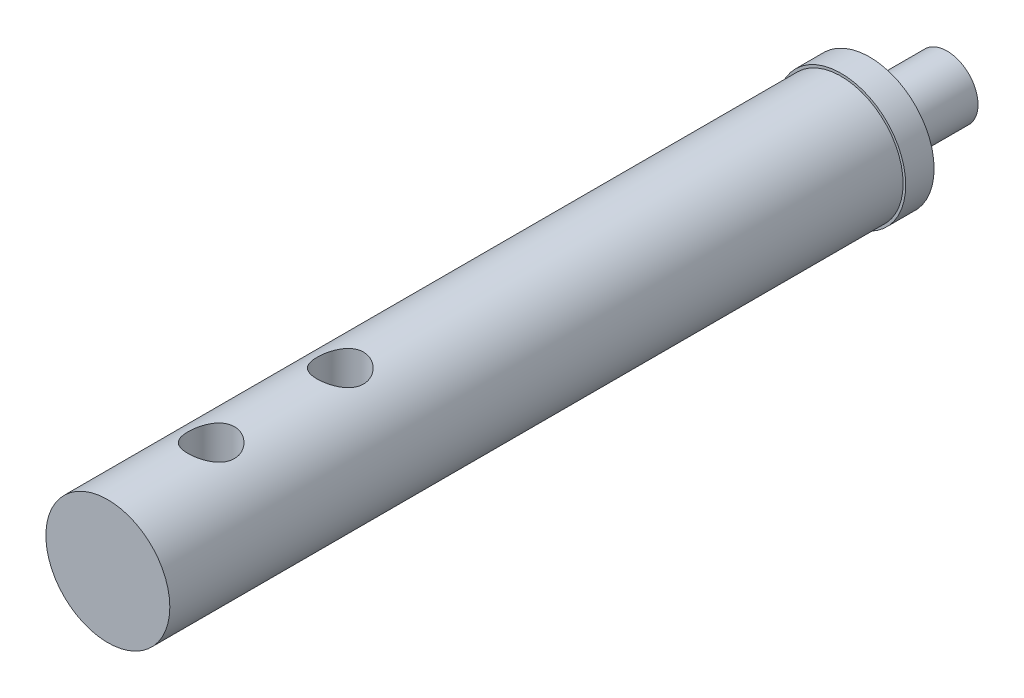
ISO-10303-21;
HEADER;
FILE_DESCRIPTION(('STEP AP214'),'2;1');
FILE_NAME('part.step','',(''),(''),'','','');
FILE_SCHEMA(('AUTOMOTIVE_DESIGN { 1 0 10303 214 1 1 1 1 }'));
ENDSEC;
DATA;
#1=APPLICATION_CONTEXT('core data for automotive mechanical design processes');
#2=APPLICATION_PROTOCOL_DEFINITION('international standard','automotive_design',2000,#1);
#3=PRODUCT_CONTEXT('',#1,'mechanical');
#4=PRODUCT('Part','Part','',(#3));
#5=PRODUCT_RELATED_PRODUCT_CATEGORY('part','',(#4));
#6=PRODUCT_DEFINITION_FORMATION('','',#4);
#7=PRODUCT_DEFINITION_CONTEXT('part definition',#1,'design');
#8=PRODUCT_DEFINITION('design','',#6,#7);
#9=PRODUCT_DEFINITION_SHAPE('','',#8);
#10=(LENGTH_UNIT() NAMED_UNIT(*) SI_UNIT(.MILLI.,.METRE.));
#11=(NAMED_UNIT(*) PLANE_ANGLE_UNIT() SI_UNIT($,.RADIAN.));
#12=(NAMED_UNIT(*) SI_UNIT($,.STERADIAN.) SOLID_ANGLE_UNIT());
#13=UNCERTAINTY_MEASURE_WITH_UNIT(LENGTH_MEASURE(1.E-05),#10,'distance_accuracy_value','');
#14=(GEOMETRIC_REPRESENTATION_CONTEXT(3) GLOBAL_UNCERTAINTY_ASSIGNED_CONTEXT((#13)) GLOBAL_UNIT_ASSIGNED_CONTEXT((#10,
#11,#12)) REPRESENTATION_CONTEXT('',''));
#15=CARTESIAN_POINT('',(0.,0.,0.));
#16=DIRECTION('',(0.,0.,1.));
#17=DIRECTION('',(1.,0.,0.));
#18=AXIS2_PLACEMENT_3D('',#15,#16,#17);
#19=CARTESIAN_POINT('',(0.,0.,15.));
#20=DIRECTION('',(0.,0.,-1.));
#21=DIRECTION('',(-1.,0.,0.));
#22=AXIS2_PLACEMENT_3D('',#19,#20,#21);
#23=CYLINDRICAL_SURFACE('',#22,6.);
#24=CARTESIAN_POINT('',(0.,0.,15.));
#25=DIRECTION('',(0.,0.,1.));
#26=DIRECTION('',(1.,0.,0.));
#27=AXIS2_PLACEMENT_3D('',#24,#25,#26);
#28=CIRCLE('',#27,6.);
#29=CARTESIAN_POINT('',(6.,0.,15.));
#30=VERTEX_POINT('',#29);
#31=EDGE_CURVE('E45',#30,#30,#28,.T.);
#32=ORIENTED_EDGE('',*,*,#31,.F.);
#33=EDGE_LOOP('',(#32));
#34=FACE_BOUND('',#33,.T.);
#35=CARTESIAN_POINT('',(0.,0.,0.));
#36=DIRECTION('',(0.,0.,1.));
#37=DIRECTION('',(1.,0.,0.));
#38=AXIS2_PLACEMENT_3D('',#35,#36,#37);
#39=CIRCLE('',#38,6.);
#40=CARTESIAN_POINT('',(6.,0.,0.));
#41=VERTEX_POINT('',#40);
#42=EDGE_CURVE('E50',#41,#41,#39,.T.);
#43=ORIENTED_EDGE('',*,*,#42,.T.);
#44=EDGE_LOOP('',(#43));
#45=FACE_BOUND('',#44,.T.);
#46=ADVANCED_FACE('F33',(#34,#45),#23,.T.);
#47=CARTESIAN_POINT('',(0.,0.,0.));
#48=DIRECTION('',(0.,0.,1.));
#49=DIRECTION('',(1.,0.,0.));
#50=AXIS2_PLACEMENT_3D('',#47,#48,#49);
#51=PLANE('',#50);
#52=ORIENTED_EDGE('',*,*,#42,.F.);
#53=EDGE_LOOP('',(#52));
#54=FACE_BOUND('',#53,.T.);
#55=ADVANCED_FACE('F95',(#54),#51,.F.);
#56=CARTESIAN_POINT('',(0.,0.,20.5));
#57=DIRECTION('',(0.,0.,-1.));
#58=DIRECTION('',(-1.,0.,0.));
#59=AXIS2_PLACEMENT_3D('',#56,#57,#58);
#60=CYLINDRICAL_SURFACE('',#59,12.5);
#61=CARTESIAN_POINT('',(0.,0.,20.5));
#62=DIRECTION('',(0.,0.,1.));
#63=DIRECTION('',(1.,0.,0.));
#64=AXIS2_PLACEMENT_3D('',#61,#62,#63);
#65=CIRCLE('',#64,12.5);
#66=CARTESIAN_POINT('',(12.5,0.,20.5));
#67=VERTEX_POINT('',#66);
#68=EDGE_CURVE('E55',#67,#67,#65,.T.);
#69=ORIENTED_EDGE('',*,*,#68,.F.);
#70=EDGE_LOOP('',(#69));
#71=FACE_BOUND('',#70,.T.);
#72=CARTESIAN_POINT('',(0.,0.,15.));
#73=DIRECTION('',(0.,0.,1.));
#74=DIRECTION('',(1.,0.,0.));
#75=AXIS2_PLACEMENT_3D('',#72,#73,#74);
#76=CIRCLE('',#75,12.5);
#77=CARTESIAN_POINT('',(12.5,0.,15.));
#78=VERTEX_POINT('',#77);
#79=EDGE_CURVE('E58',#78,#78,#76,.T.);
#80=ORIENTED_EDGE('',*,*,#79,.T.);
#81=EDGE_LOOP('',(#80));
#82=FACE_BOUND('',#81,.T.);
#83=ADVANCED_FACE('F100',(#71,#82),#60,.T.);
#84=CARTESIAN_POINT('',(0.,0.,20.5));
#85=DIRECTION('',(0.,0.,1.));
#86=DIRECTION('',(1.,0.,0.));
#87=AXIS2_PLACEMENT_3D('',#84,#85,#86);
#88=PLANE('',#87);
#89=CARTESIAN_POINT('',(0.,0.,20.5));
#90=DIRECTION('',(0.,0.,1.));
#91=DIRECTION('',(1.,0.,0.));
#92=AXIS2_PLACEMENT_3D('',#89,#90,#91);
#93=CIRCLE('',#92,12.);
#94=CARTESIAN_POINT('',(12.,0.,20.5));
#95=VERTEX_POINT('',#94);
#96=EDGE_CURVE('E10',#95,#95,#93,.T.);
#97=ORIENTED_EDGE('',*,*,#96,.F.);
#98=EDGE_LOOP('',(#97));
#99=FACE_BOUND('',#98,.T.);
#100=ORIENTED_EDGE('',*,*,#68,.T.);
#101=EDGE_LOOP('',(#100));
#102=FACE_BOUND('',#101,.T.);
#103=ADVANCED_FACE('F108',(#99,#102),#88,.T.);
#104=CARTESIAN_POINT('',(0.,0.,15.));
#105=DIRECTION('',(0.,0.,1.));
#106=DIRECTION('',(1.,0.,0.));
#107=AXIS2_PLACEMENT_3D('',#104,#105,#106);
#108=PLANE('',#107);
#109=ORIENTED_EDGE('',*,*,#31,.T.);
#110=EDGE_LOOP('',(#109));
#111=FACE_BOUND('',#110,.T.);
#112=ORIENTED_EDGE('',*,*,#79,.F.);
#113=EDGE_LOOP('',(#112));
#114=FACE_BOUND('',#113,.T.);
#115=ADVANCED_FACE('F91',(#111,#114),#108,.F.);
#116=CARTESIAN_POINT('',(0.,0.,162.5));
#117=DIRECTION('',(0.,0.,-1.));
#118=DIRECTION('',(-1.,0.,0.));
#119=AXIS2_PLACEMENT_3D('',#116,#117,#118);
#120=CYLINDRICAL_SURFACE('',#119,12.);
#121=CARTESIAN_POINT('',(0.,-12.,122.));
#122=CARTESIAN_POINT('',(0.12182192021614,-12.0000004149463,122.000000562589));
#123=CARTESIAN_POINT('',(0.243636002691334,-11.9981409348073,121.995049364538));
#124=CARTESIAN_POINT('',(0.486392423781213,-11.9907535477711,121.975293911887));
#125=CARTESIAN_POINT('',(0.607334471202249,-11.9852244680872,121.960486507286));
#126=CARTESIAN_POINT('',(0.847347381687182,-11.970649565472,121.921174413436));
#127=CARTESIAN_POINT('',(0.966419205128129,-11.9616056132673,121.896674882519));
#128=CARTESIAN_POINT('',(1.2019581040135,-11.9402382455256,121.83820576059));
#129=CARTESIAN_POINT('',(1.31842414848255,-11.9279135559973,121.804232490447));
#130=CARTESIAN_POINT('',(1.54765442429003,-11.9003384511568,121.727214849951));
#131=CARTESIAN_POINT('',(1.660426734491,-11.8850950009216,121.684192050998));
#132=CARTESIAN_POINT('',(1.88185705605878,-11.8520536393113,121.589393964957));
#133=CARTESIAN_POINT('',(1.99051352350808,-11.8342547811235,121.537615432482));
#134=CARTESIAN_POINT('',(2.30927279411985,-11.7776768093622,121.369731594457));
#135=CARTESIAN_POINT('',(2.51234231941558,-11.7356939966761,121.241018203868));
#136=CARTESIAN_POINT('',(2.90206977477989,-11.6455850212357,120.948156633399));
#137=CARTESIAN_POINT('',(3.08780172063125,-11.5972851945296,120.782840477992));
#138=CARTESIAN_POINT('',(3.42974311725175,-11.500801507554,120.423737421702));
#139=CARTESIAN_POINT('',(3.58594353155376,-11.4526176872201,120.229941838426));
#140=CARTESIAN_POINT('',(3.79764477617944,-11.3834841407686,119.917559070828));
#141=CARTESIAN_POINT('',(3.86547493196535,-11.3605705131175,119.807562616254));
#142=CARTESIAN_POINT('',(3.99157408188854,-11.3168804194774,119.581831512047));
#143=CARTESIAN_POINT('',(4.04984690983614,-11.2961030977882,119.466099187672));
#144=CARTESIAN_POINT('',(4.15634309619243,-11.2573544123991,119.229634242611));
#145=CARTESIAN_POINT('',(4.20456527896396,-11.2393833770156,119.108901038945));
#146=CARTESIAN_POINT('',(4.29047551547084,-11.2068698048304,118.863350953977));
#147=CARTESIAN_POINT('',(4.32816865016454,-11.1923256148824,118.738536074949));
#148=CARTESIAN_POINT('',(4.39133833063889,-11.167687799886,118.490864282486));
#149=CARTESIAN_POINT('',(4.41724869222401,-11.1574374723367,118.368133574559));
#150=CARTESIAN_POINT('',(4.45874705417236,-11.1409189584307,118.120724885637));
#151=CARTESIAN_POINT('',(4.47433956871922,-11.1346490306496,117.996047780687));
#152=CARTESIAN_POINT('',(4.49504192825721,-11.1263077224061,117.745703904304));
#153=CARTESIAN_POINT('',(4.50015334189904,-11.124235713664,117.620037283793));
#154=CARTESIAN_POINT('',(4.4998396408155,-11.124362586323,117.368723898627));
#155=CARTESIAN_POINT('',(4.49441493477359,-11.1265613020677,117.24307713339));
#156=CARTESIAN_POINT('',(4.47373138181252,-11.1348931002806,117.000345583509));
#157=CARTESIAN_POINT('',(4.45908334347361,-11.1407817124043,116.883200175152));
#158=CARTESIAN_POINT('',(4.42068867776497,-11.1560711786316,116.650631735769));
#159=CARTESIAN_POINT('',(4.39693902815624,-11.1654731993557,116.535209290103));
#160=CARTESIAN_POINT('',(4.31234407385655,-11.1985472030748,116.192770983112));
#161=CARTESIAN_POINT('',(4.23813423625877,-11.2270952052095,115.969371280221));
#162=CARTESIAN_POINT('',(4.05490721343479,-11.294571324263,115.534132319446));
#163=CARTESIAN_POINT('',(3.94525805379048,-11.3336856090865,115.322591744781));
#164=CARTESIAN_POINT('',(3.69468362169032,-11.417826234714,114.920172587469));
#165=CARTESIAN_POINT('',(3.55374755073014,-11.4628546145386,114.729301172593));
#166=CARTESIAN_POINT('',(3.23345300799873,-11.5574411862383,114.360186122089));
#167=CARTESIAN_POINT('',(3.05214885027356,-11.607100429164,114.18365330368));
#168=CARTESIAN_POINT('',(2.66193788370926,-11.7027518394278,113.862986875577));
#169=CARTESIAN_POINT('',(2.45302684040983,-11.748743442469,113.718858245353));
#170=CARTESIAN_POINT('',(2.00917028059689,-11.8327918458053,113.465208596408));
#171=CARTESIAN_POINT('',(1.77387213379262,-11.8707149483013,113.356257198474));
#172=CARTESIAN_POINT('',(1.28651055931184,-11.9333615492963,113.180052245027));
#173=CARTESIAN_POINT('',(1.03445463312944,-11.9580909097264,113.1127801694));
#174=CARTESIAN_POINT('',(0.535125728885336,-11.9905332973328,113.025131619306));
#175=CARTESIAN_POINT('',(0.288310863440806,-11.9990810722223,113.002452162351));
#176=CARTESIAN_POINT('',(-0.205717430518199,-12.0007768095524,112.997926826798));
#177=CARTESIAN_POINT('',(-0.452930758520922,-11.9939281862917,113.016071894972));
#178=CARTESIAN_POINT('',(-0.930786126866777,-11.9661512982893,113.090930073153));
#179=CARTESIAN_POINT('',(-1.16169991458787,-11.9457741475744,113.146134437354));
#180=CARTESIAN_POINT('',(-1.61082533431484,-11.8935442940439,113.291558411525));
#181=CARTESIAN_POINT('',(-1.82903531000967,-11.8616900987367,113.381782575637));
#182=CARTESIAN_POINT('',(-2.25374302875423,-11.7884888040033,113.597558494317));
#183=CARTESIAN_POINT('',(-2.45970824228691,-11.7468902777666,113.724070377444));
#184=CARTESIAN_POINT('',(-2.84817914393921,-11.6587998753534,114.00775712078));
#185=CARTESIAN_POINT('',(-3.03067612982123,-11.6123061955645,114.164943301224));
#186=CARTESIAN_POINT('',(-3.37808840855273,-11.516200958323,114.516201253386));
#187=CARTESIAN_POINT('',(-3.54136933947527,-11.4665650100462,114.711883953797));
#188=CARTESIAN_POINT('',(-3.83314678656079,-11.372360357102,115.128996752467));
#189=CARTESIAN_POINT('',(-3.96164017919755,-11.3277921076647,115.350429160208));
#190=CARTESIAN_POINT('',(-4.12541953452075,-11.2687303690453,115.697922796397));
#191=CARTESIAN_POINT('',(-4.17527938653557,-11.2503030894951,115.816647329586));
#192=CARTESIAN_POINT('',(-4.26475585416721,-11.2166905930926,116.058323845116));
#193=CARTESIAN_POINT('',(-4.30437682733461,-11.2015039975232,116.181274003754));
#194=CARTESIAN_POINT('',(-4.37296242168505,-11.1749073223601,116.430466472104));
#195=CARTESIAN_POINT('',(-4.40193024471253,-11.163496108165,116.556707780413));
#196=CARTESIAN_POINT('',(-4.44890662829911,-11.1448585297206,116.81151813959));
#197=CARTESIAN_POINT('',(-4.46691595320738,-11.1376318736025,116.940087027466));
#198=CARTESIAN_POINT('',(-4.4909611175474,-11.1279568107625,117.190138338187));
#199=CARTESIAN_POINT('',(-4.4976937576826,-11.1252304971503,117.311543515748));
#200=CARTESIAN_POINT('',(-4.50131029580419,-11.1237678185175,117.554568299403));
#201=CARTESIAN_POINT('',(-4.49819087218451,-11.1250327991546,117.676187963996));
#202=CARTESIAN_POINT('',(-4.48213280066959,-11.131512007523,117.918611778483));
#203=CARTESIAN_POINT('',(-4.46919877710471,-11.1367243753675,118.039416285416));
#204=CARTESIAN_POINT('',(-4.4336489114592,-11.150924738849,118.279410101132));
#205=CARTESIAN_POINT('',(-4.41102942370239,-11.1599141561698,118.398598784262));
#206=CARTESIAN_POINT('',(-4.35718066722756,-11.1810458214159,118.630811506595));
#207=CARTESIAN_POINT('',(-4.3262397945842,-11.1930817833517,118.743912139277));
#208=CARTESIAN_POINT('',(-4.25575591081443,-11.220069483486,118.967056271898));
#209=CARTESIAN_POINT('',(-4.21620988547499,-11.23502224319,119.077098685333));
#210=CARTESIAN_POINT('',(-4.08512625929658,-11.2836374066331,119.401595505612));
#211=CARTESIAN_POINT('',(-3.98110253179988,-11.3210734609741,119.610592817196));
#212=CARTESIAN_POINT('',(-3.73655960136619,-11.4041928736043,120.019509886323));
#213=CARTESIAN_POINT('',(-3.59441315608532,-11.4502056852775,120.218379513829));
#214=CARTESIAN_POINT('',(-3.28000639093495,-11.5441926723435,120.590437563583));
#215=CARTESIAN_POINT('',(-3.10773650011231,-11.5921674673836,120.763617791262));
#216=CARTESIAN_POINT('',(-2.82485495768739,-11.6632064644304,121.005245875948));
#217=CARTESIAN_POINT('',(-2.72355677041141,-11.6873329442322,121.084523984934));
#218=CARTESIAN_POINT('',(-2.51433251035991,-11.7341212355869,121.234254321495));
#219=CARTESIAN_POINT('',(-2.40640888366378,-11.7567835814237,121.304709777492));
#220=CARTESIAN_POINT('',(-2.18454509687348,-11.8000231112314,121.436294134108));
#221=CARTESIAN_POINT('',(-2.0706017726869,-11.8205991816831,121.497418062869));
#222=CARTESIAN_POINT('',(-1.83755175113717,-11.8590616275344,121.609759993606));
#223=CARTESIAN_POINT('',(-1.71844727331546,-11.8769491446375,121.66098220304));
#224=CARTESIAN_POINT('',(-1.47053797162901,-11.9102407175975,121.755097964792));
#225=CARTESIAN_POINT('',(-1.3415368617529,-11.9255011706843,121.797526838323));
#226=CARTESIAN_POINT('',(-1.07989915577463,-11.9520331999052,121.870612963128));
#227=CARTESIAN_POINT('',(-0.94726417967495,-11.9633065233273,121.901275371348));
#228=CARTESIAN_POINT('',(-0.679492491904579,-11.9814979813589,121.950485060083));
#229=CARTESIAN_POINT('',(-0.54435622620707,-11.9884168847946,121.969034479318));
#230=CARTESIAN_POINT('',(-0.27280993479055,-11.9976674031164,121.993790938277));
#231=CARTESIAN_POINT('',(-0.136400054481801,-11.9999995353981,121.999999370088));
#232=CARTESIAN_POINT('',(0.,-12.,122.));
#233=B_SPLINE_CURVE_WITH_KNOTS('',3,(#121,#122,#123,#124,#125,#126,#127,#128,#129,#130,#131,
#132,#133,#134,#135,#136,#137,#138,#139,#140,#141,#142,#143,#144,#145,#146,#147,#148,#149,#150,
#151,#152,#153,#154,#155,#156,#157,#158,#159,#160,#161,#162,#163,#164,#165,#166,#167,#168,#169,
#170,#171,#172,#173,#174,#175,#176,#177,#178,#179,#180,#181,#182,#183,#184,#185,#186,#187,#188,
#189,#190,#191,#192,#193,#194,#195,#196,#197,#198,#199,#200,#201,#202,#203,#204,#205,#206,#207,
#208,#209,#210,#211,#212,#213,#214,#215,#216,#217,#218,#219,#220,#221,#222,#223,#224,#225,#226,
#227,#228,#229,#230,#231,#232),.UNSPECIFIED.,.T.,.F.,(4,2,2,2,2,2,2,2,2,2,2,2,2,2,2,2,2,2,2,2,2,
2,2,2,2,2,2,2,2,2,2,2,2,2,2,2,2,2,2,2,2,2,2,2,2,2,2,2,2,2,2,2,2,2,2,4),(0.,0.365338024506952,
0.730792865566524,1.09605346575198,1.46145611308565,1.82599742407274,2.19067415273862,
2.91947018392638,3.67616860257936,4.43309819286655,4.82642681378562,5.21959726757258,
5.61281368524465,6.00584002102327,6.38291145568139,6.75981780772977,7.13666774608809,
7.51350306718049,7.86768402280123,8.22198268815954,8.92994647641831,9.65130458621119,
10.3729120569284,11.143016934675,11.9132400717526,12.6953735931829,13.477159325566,
14.2173829236784,14.9574423863163,15.6690654723159,16.3807811322343,17.1134089903886,
17.8463077351967,18.6217279182704,19.3972177022049,19.7870381951625,20.1766925107004,
20.5662296182681,20.9557395527225,21.3201489316714,21.6846811837186,22.0490417862154,
22.4135396573091,22.7667469946614,23.1200782532196,23.8262105801188,24.5693581369517,
25.3127422403354,25.7049754844993,26.0970647789657,26.4893622558027,26.8814926686162,
27.2908478409866,27.7000233978563,28.1091266894863,28.5181838309154),.UNSPECIFIED.);
#234=CARTESIAN_POINT('',(0.,-12.,122.));
#235=VERTEX_POINT('',#234);
#236=EDGE_CURVE('E36',#235,#235,#233,.T.);
#237=ORIENTED_EDGE('',*,*,#236,.T.);
#238=EDGE_LOOP('',(#237));
#239=FACE_BOUND('',#238,.T.);
#240=CARTESIAN_POINT('',(0.,12.,122.));
#241=CARTESIAN_POINT('',(-0.121821920216147,12.0000004149463,122.000000562589));
#242=CARTESIAN_POINT('',(-0.243636002691342,11.9981409348073,121.995049364538));
#243=CARTESIAN_POINT('',(-0.486392423781221,11.9907535477711,121.975293911887));
#244=CARTESIAN_POINT('',(-0.607334471202256,11.9852244680872,121.960486507286));
#245=CARTESIAN_POINT('',(-0.847347381687191,11.970649565472,121.921174413436));
#246=CARTESIAN_POINT('',(-0.966419205128139,11.9616056132673,121.896674882519));
#247=CARTESIAN_POINT('',(-1.20195810401351,11.9402382455256,121.83820576059));
#248=CARTESIAN_POINT('',(-1.31842414848256,11.9279135559973,121.804232490447));
#249=CARTESIAN_POINT('',(-1.54765442429004,11.9003384511568,121.727214849951));
#250=CARTESIAN_POINT('',(-1.66042673449101,11.8850950009216,121.684192050998));
#251=CARTESIAN_POINT('',(-1.88185705605879,11.8520536393113,121.589393964957));
#252=CARTESIAN_POINT('',(-1.99051352350809,11.8342547811235,121.537615432482));
#253=CARTESIAN_POINT('',(-2.30927279411986,11.7776768093622,121.369731594457));
#254=CARTESIAN_POINT('',(-2.51234231941558,11.7356939966761,121.241018203868));
#255=CARTESIAN_POINT('',(-2.90206977477989,11.6455850212357,120.948156633399));
#256=CARTESIAN_POINT('',(-3.08780172063126,11.5972851945296,120.782840477992));
#257=CARTESIAN_POINT('',(-3.42974311725176,11.500801507554,120.423737421702));
#258=CARTESIAN_POINT('',(-3.58594353155377,11.4526176872201,120.229941838426));
#259=CARTESIAN_POINT('',(-3.79764477617945,11.3834841407686,119.917559070828));
#260=CARTESIAN_POINT('',(-3.86547493196535,11.3605705131175,119.807562616254));
#261=CARTESIAN_POINT('',(-3.99157408188855,11.3168804194774,119.581831512047));
#262=CARTESIAN_POINT('',(-4.04984690983615,11.2961030977882,119.466099187672));
#263=CARTESIAN_POINT('',(-4.15634309619243,11.2573544123991,119.229634242611));
#264=CARTESIAN_POINT('',(-4.20456527896397,11.2393833770156,119.108901038945));
#265=CARTESIAN_POINT('',(-4.29047551547084,11.2068698048304,118.863350953977));
#266=CARTESIAN_POINT('',(-4.32816865016454,11.1923256148824,118.738536074949));
#267=CARTESIAN_POINT('',(-4.3913383306389,11.167687799886,118.490864282486));
#268=CARTESIAN_POINT('',(-4.41724869222401,11.1574374723367,118.368133574559));
#269=CARTESIAN_POINT('',(-4.45874705417236,11.1409189584307,118.120724885637));
#270=CARTESIAN_POINT('',(-4.47433956871923,11.1346490306496,117.996047780687));
#271=CARTESIAN_POINT('',(-4.49504192825722,11.1263077224061,117.745703904304));
#272=CARTESIAN_POINT('',(-4.50015334189905,11.124235713664,117.620037283793));
#273=CARTESIAN_POINT('',(-4.49983964081551,11.124362586323,117.368723898627));
#274=CARTESIAN_POINT('',(-4.4944149347736,11.1265613020677,117.24307713339));
#275=CARTESIAN_POINT('',(-4.47373138181252,11.1348931002806,117.000345583509));
#276=CARTESIAN_POINT('',(-4.45908334347362,11.1407817124043,116.883200175152));
#277=CARTESIAN_POINT('',(-4.42068867776498,11.1560711786316,116.650631735769));
#278=CARTESIAN_POINT('',(-4.39693902815625,11.1654731993557,116.535209290103));
#279=CARTESIAN_POINT('',(-4.31234407385656,11.1985472030748,116.192770983112));
#280=CARTESIAN_POINT('',(-4.23813423625878,11.2270952052095,115.969371280221));
#281=CARTESIAN_POINT('',(-4.05490721343479,11.294571324263,115.534132319446));
#282=CARTESIAN_POINT('',(-3.94525805379049,11.3336856090865,115.322591744781));
#283=CARTESIAN_POINT('',(-3.69468362169033,11.417826234714,114.920172587469));
#284=CARTESIAN_POINT('',(-3.55374755073015,11.4628546145386,114.729301172593));
#285=CARTESIAN_POINT('',(-3.23345300799873,11.5574411862383,114.360186122089));
#286=CARTESIAN_POINT('',(-3.05214885027357,11.607100429164,114.18365330368));
#287=CARTESIAN_POINT('',(-2.66193788370927,11.7027518394278,113.862986875577));
#288=CARTESIAN_POINT('',(-2.45302684040983,11.748743442469,113.718858245353));
#289=CARTESIAN_POINT('',(-2.0091702805969,11.8327918458053,113.465208596408));
#290=CARTESIAN_POINT('',(-1.77387213379263,11.8707149483013,113.356257198474));
#291=CARTESIAN_POINT('',(-1.28651055931185,11.9333615492963,113.180052245027));
#292=CARTESIAN_POINT('',(-1.03445463312945,11.9580909097264,113.1127801694));
#293=CARTESIAN_POINT('',(-0.535125728885344,11.9905332973328,113.025131619306));
#294=CARTESIAN_POINT('',(-0.288310863440814,11.9990810722223,113.002452162351));
#295=CARTESIAN_POINT('',(0.205717430518191,12.0007768095524,112.997926826798));
#296=CARTESIAN_POINT('',(0.452930758520915,11.9939281862917,113.016071894972));
#297=CARTESIAN_POINT('',(0.93078612686677,11.9661512982893,113.090930073153));
#298=CARTESIAN_POINT('',(1.16169991458786,11.9457741475744,113.146134437354));
#299=CARTESIAN_POINT('',(1.61082533431483,11.8935442940439,113.291558411525));
#300=CARTESIAN_POINT('',(1.82903531000967,11.8616900987367,113.381782575637));
#301=CARTESIAN_POINT('',(2.25374302875422,11.7884888040033,113.597558494317));
#302=CARTESIAN_POINT('',(2.4597082422869,11.7468902777666,113.724070377444));
#303=CARTESIAN_POINT('',(2.8481791439392,11.6587998753534,114.00775712078));
#304=CARTESIAN_POINT('',(3.03067612982123,11.6123061955645,114.164943301224));
#305=CARTESIAN_POINT('',(3.37808840855273,11.516200958323,114.516201253386));
#306=CARTESIAN_POINT('',(3.54136933947527,11.4665650100462,114.711883953797));
#307=CARTESIAN_POINT('',(3.83314678656078,11.372360357102,115.128996752467));
#308=CARTESIAN_POINT('',(3.96164017919754,11.3277921076647,115.350429160208));
#309=CARTESIAN_POINT('',(4.12541953452074,11.2687303690453,115.697922796397));
#310=CARTESIAN_POINT('',(4.17527938653557,11.2503030894951,115.816647329586));
#311=CARTESIAN_POINT('',(4.26475585416721,11.2166905930926,116.058323845116));
#312=CARTESIAN_POINT('',(4.3043768273346,11.2015039975232,116.181274003754));
#313=CARTESIAN_POINT('',(4.37296242168504,11.1749073223601,116.430466472104));
#314=CARTESIAN_POINT('',(4.40193024471253,11.163496108165,116.556707780413));
#315=CARTESIAN_POINT('',(4.4489066282991,11.1448585297206,116.81151813959));
#316=CARTESIAN_POINT('',(4.46691595320738,11.1376318736025,116.940087027466));
#317=CARTESIAN_POINT('',(4.49096111754739,11.1279568107625,117.190138338187));
#318=CARTESIAN_POINT('',(4.49769375768259,11.1252304971503,117.311543515748));
#319=CARTESIAN_POINT('',(4.50131029580418,11.1237678185175,117.554568299403));
#320=CARTESIAN_POINT('',(4.4981908721845,11.1250327991546,117.676187963996));
#321=CARTESIAN_POINT('',(4.48213280066958,11.131512007523,117.918611778483));
#322=CARTESIAN_POINT('',(4.46919877710471,11.1367243753675,118.039416285416));
#323=CARTESIAN_POINT('',(4.4336489114592,11.150924738849,118.279410101132));
#324=CARTESIAN_POINT('',(4.41102942370238,11.1599141561698,118.398598784262));
#325=CARTESIAN_POINT('',(4.35718066722755,11.1810458214159,118.630811506595));
#326=CARTESIAN_POINT('',(4.3262397945842,11.1930817833517,118.743912139277));
#327=CARTESIAN_POINT('',(4.25575591081442,11.220069483486,118.967056271898));
#328=CARTESIAN_POINT('',(4.21620988547499,11.23502224319,119.077098685333));
#329=CARTESIAN_POINT('',(4.08512625929658,11.2836374066331,119.401595505612));
#330=CARTESIAN_POINT('',(3.98110253179987,11.3210734609741,119.610592817196));
#331=CARTESIAN_POINT('',(3.73655960136618,11.4041928736043,120.019509886323));
#332=CARTESIAN_POINT('',(3.59441315608531,11.4502056852775,120.218379513829));
#333=CARTESIAN_POINT('',(3.28000639093494,11.5441926723435,120.590437563583));
#334=CARTESIAN_POINT('',(3.1077365001123,11.5921674673836,120.763617791262));
#335=CARTESIAN_POINT('',(2.82485495768738,11.6632064644304,121.005245875948));
#336=CARTESIAN_POINT('',(2.7235567704114,11.6873329442322,121.084523984934));
#337=CARTESIAN_POINT('',(2.51433251035991,11.7341212355869,121.234254321495));
#338=CARTESIAN_POINT('',(2.40640888366377,11.7567835814237,121.304709777492));
#339=CARTESIAN_POINT('',(2.18454509687348,11.8000231112314,121.436294134108));
#340=CARTESIAN_POINT('',(2.07060177268689,11.8205991816831,121.497418062869));
#341=CARTESIAN_POINT('',(1.83755175113716,11.8590616275344,121.609759993606));
#342=CARTESIAN_POINT('',(1.71844727331545,11.8769491446375,121.66098220304));
#343=CARTESIAN_POINT('',(1.470537971629,11.9102407175975,121.755097964792));
#344=CARTESIAN_POINT('',(1.34153686175289,11.9255011706843,121.797526838323));
#345=CARTESIAN_POINT('',(1.07989915577462,11.9520331999052,121.870612963128));
#346=CARTESIAN_POINT('',(0.94726417967494,11.9633065233273,121.901275371348));
#347=CARTESIAN_POINT('',(0.67949249190457,11.9814979813589,121.950485060083));
#348=CARTESIAN_POINT('',(0.544356226207062,11.9884168847946,121.969034479318));
#349=CARTESIAN_POINT('',(0.272809934790544,11.9976674031164,121.993790938277));
#350=CARTESIAN_POINT('',(0.136400054481794,11.9999995353981,121.999999370088));
#351=CARTESIAN_POINT('',(0.,12.,122.));
#352=B_SPLINE_CURVE_WITH_KNOTS('',3,(#240,#241,#242,#243,#244,#245,#246,#247,#248,#249,#250,
#251,#252,#253,#254,#255,#256,#257,#258,#259,#260,#261,#262,#263,#264,#265,#266,#267,#268,#269,
#270,#271,#272,#273,#274,#275,#276,#277,#278,#279,#280,#281,#282,#283,#284,#285,#286,#287,#288,
#289,#290,#291,#292,#293,#294,#295,#296,#297,#298,#299,#300,#301,#302,#303,#304,#305,#306,#307,
#308,#309,#310,#311,#312,#313,#314,#315,#316,#317,#318,#319,#320,#321,#322,#323,#324,#325,#326,
#327,#328,#329,#330,#331,#332,#333,#334,#335,#336,#337,#338,#339,#340,#341,#342,#343,#344,#345,
#346,#347,#348,#349,#350,#351),.UNSPECIFIED.,.T.,.F.,(4,2,2,2,2,2,2,2,2,2,2,2,2,2,2,2,2,2,2,2,2,
2,2,2,2,2,2,2,2,2,2,2,2,2,2,2,2,2,2,2,2,2,2,2,2,2,2,2,2,2,2,2,2,2,2,4),(0.,0.365338024506952,
0.730792865566525,1.09605346575198,1.46145611308565,1.82599742407274,2.19067415273862,
2.91947018392638,3.67616860257936,4.43309819286655,4.82642681378562,5.21959726757258,
5.61281368524465,6.00584002102327,6.38291145568136,6.75981780772974,7.13666774608808,
7.51350306718049,7.86768402280121,8.22198268815954,8.92994647641831,9.65130458621118,
10.3729120569284,11.143016934675,11.9132400717526,12.6953735931829,13.477159325566,
14.2173829236784,14.9574423863163,15.6690654723159,16.3807811322343,17.1134089903886,
17.8463077351967,18.6217279182704,19.3972177022049,19.7870381951625,20.1766925107004,
20.566229618268,20.9557395527224,21.3201489316713,21.6846811837186,22.0490417862153,
22.4135396573091,22.7667469946614,23.1200782532196,23.8262105801188,24.5693581369517,
25.3127422403354,25.7049754844993,26.0970647789657,26.4893622558027,26.8814926686161,
27.2908478409866,27.7000233978563,28.1091266894863,28.5181838309154),.UNSPECIFIED.);
#353=CARTESIAN_POINT('',(0.,12.,122.));
#354=VERTEX_POINT('',#353);
#355=EDGE_CURVE('E156',#354,#354,#352,.T.);
#356=ORIENTED_EDGE('',*,*,#355,.T.);
#357=EDGE_LOOP('',(#356));
#358=FACE_BOUND('',#357,.T.);
#359=CARTESIAN_POINT('',(0.,-12.,147.));
#360=CARTESIAN_POINT('',(0.121821920216141,-12.0000004149463,147.000000562589));
#361=CARTESIAN_POINT('',(0.243636002691335,-11.9981409348073,146.995049364538));
#362=CARTESIAN_POINT('',(0.486392423781216,-11.9907535477711,146.975293911887));
#363=CARTESIAN_POINT('',(0.607334471202253,-11.9852244680872,146.960486507286));
#364=CARTESIAN_POINT('',(0.84734738168719,-11.970649565472,146.921174413436));
#365=CARTESIAN_POINT('',(0.966419205128139,-11.9616056132673,146.896674882519));
#366=CARTESIAN_POINT('',(1.20195810401351,-11.9402382455256,146.83820576059));
#367=CARTESIAN_POINT('',(1.31842414848256,-11.9279135559973,146.804232490447));
#368=CARTESIAN_POINT('',(1.54765442429004,-11.9003384511568,146.727214849951));
#369=CARTESIAN_POINT('',(1.660426734491,-11.8850950009216,146.684192050998));
#370=CARTESIAN_POINT('',(1.88185705605878,-11.8520536393113,146.589393964957));
#371=CARTESIAN_POINT('',(1.99051352350808,-11.8342547811235,146.537615432482));
#372=CARTESIAN_POINT('',(2.30927279411985,-11.7776768093622,146.369731594457));
#373=CARTESIAN_POINT('',(2.51234231941558,-11.7356939966761,146.241018203868));
#374=CARTESIAN_POINT('',(2.90206977477989,-11.6455850212357,145.948156633399));
#375=CARTESIAN_POINT('',(3.08780172063126,-11.5972851945296,145.782840477992));
#376=CARTESIAN_POINT('',(3.42974311725176,-11.500801507554,145.423737421702));
#377=CARTESIAN_POINT('',(3.58594353155377,-11.4526176872201,145.229941838426));
#378=CARTESIAN_POINT('',(3.79764477617944,-11.3834841407686,144.917559070828));
#379=CARTESIAN_POINT('',(3.86547493196535,-11.3605705131175,144.807562616254));
#380=CARTESIAN_POINT('',(3.99157408188855,-11.3168804194774,144.581831512047));
#381=CARTESIAN_POINT('',(4.04984690983616,-11.2961030977882,144.466099187672));
#382=CARTESIAN_POINT('',(4.15634309619244,-11.257354412399,144.229634242611));
#383=CARTESIAN_POINT('',(4.20456527896397,-11.2393833770156,144.108901038945));
#384=CARTESIAN_POINT('',(4.29047551547084,-11.2068698048304,143.863350953977));
#385=CARTESIAN_POINT('',(4.32816865016454,-11.1923256148824,143.738536074949));
#386=CARTESIAN_POINT('',(4.39133833063889,-11.167687799886,143.490864282486));
#387=CARTESIAN_POINT('',(4.41724869222401,-11.1574374723367,143.368133574559));
#388=CARTESIAN_POINT('',(4.45874705417236,-11.1409189584307,143.120724885637));
#389=CARTESIAN_POINT('',(4.47433956871922,-11.1346490306496,142.996047780687));
#390=CARTESIAN_POINT('',(4.49504192825721,-11.1263077224061,142.745703904304));
#391=CARTESIAN_POINT('',(4.50015334189904,-11.124235713664,142.620037283793));
#392=CARTESIAN_POINT('',(4.4998396408155,-11.124362586323,142.368723898627));
#393=CARTESIAN_POINT('',(4.49441493477359,-11.1265613020677,142.24307713339));
#394=CARTESIAN_POINT('',(4.47373138181252,-11.1348931002806,142.000345583509));
#395=CARTESIAN_POINT('',(4.45908334347361,-11.1407817124043,141.883200175152));
#396=CARTESIAN_POINT('',(4.42068867776497,-11.1560711786316,141.650631735769));
#397=CARTESIAN_POINT('',(4.39693902815624,-11.1654731993557,141.535209290103));
#398=CARTESIAN_POINT('',(4.31234407385654,-11.1985472030748,141.192770983112));
#399=CARTESIAN_POINT('',(4.23813423625877,-11.2270952052095,140.969371280221));
#400=CARTESIAN_POINT('',(4.05490721343479,-11.294571324263,140.534132319446));
#401=CARTESIAN_POINT('',(3.94525805379049,-11.3336856090865,140.322591744781));
#402=CARTESIAN_POINT('',(3.69468362169033,-11.417826234714,139.920172587469));
#403=CARTESIAN_POINT('',(3.55374755073014,-11.4628546145386,139.729301172593));
#404=CARTESIAN_POINT('',(3.23345300799871,-11.5574411862383,139.360186122089));
#405=CARTESIAN_POINT('',(3.05214885027354,-11.607100429164,139.18365330368));
#406=CARTESIAN_POINT('',(2.66193788370923,-11.7027518394278,138.862986875577));
#407=CARTESIAN_POINT('',(2.4530268404098,-11.7487434424691,138.718858245353));
#408=CARTESIAN_POINT('',(2.00917028059687,-11.8327918458053,138.465208596408));
#409=CARTESIAN_POINT('',(1.77387213379261,-11.8707149483013,138.356257198474));
#410=CARTESIAN_POINT('',(1.28651055931184,-11.9333615492963,138.180052245027));
#411=CARTESIAN_POINT('',(1.03445463312944,-11.9580909097264,138.1127801694));
#412=CARTESIAN_POINT('',(0.535125728885332,-11.9905332973328,138.025131619306));
#413=CARTESIAN_POINT('',(0.288310863440802,-11.9990810722223,138.002452162351));
#414=CARTESIAN_POINT('',(-0.205717430518205,-12.0007768095524,137.997926826798));
#415=CARTESIAN_POINT('',(-0.452930758520928,-11.9939281862917,138.016071894972));
#416=CARTESIAN_POINT('',(-0.930786126866782,-11.9661512982893,138.090930073153));
#417=CARTESIAN_POINT('',(-1.16169991458787,-11.9457741475744,138.146134437354));
#418=CARTESIAN_POINT('',(-1.61082533431484,-11.8935442940439,138.291558411525));
#419=CARTESIAN_POINT('',(-1.82903531000967,-11.8616900987367,138.381782575637));
#420=CARTESIAN_POINT('',(-2.25374302875423,-11.7884888040033,138.597558494317));
#421=CARTESIAN_POINT('',(-2.4597082422869,-11.7468902777666,138.724070377444));
#422=CARTESIAN_POINT('',(-2.84817914393921,-11.6587998753534,139.00775712078));
#423=CARTESIAN_POINT('',(-3.03067612982124,-11.6123061955645,139.164943301224));
#424=CARTESIAN_POINT('',(-3.37808840855274,-11.516200958323,139.516201253386));
#425=CARTESIAN_POINT('',(-3.54136933947528,-11.4665650100462,139.711883953797));
#426=CARTESIAN_POINT('',(-3.83314678656079,-11.372360357102,140.128996752467));
#427=CARTESIAN_POINT('',(-3.96164017919755,-11.3277921076647,140.350429160208));
#428=CARTESIAN_POINT('',(-4.12541953452075,-11.2687303690453,140.697922796397));
#429=CARTESIAN_POINT('',(-4.17527938653558,-11.2503030894951,140.816647329586));
#430=CARTESIAN_POINT('',(-4.26475585416722,-11.2166905930926,141.058323845116));
#431=CARTESIAN_POINT('',(-4.30437682733461,-11.2015039975232,141.181274003754));
#432=CARTESIAN_POINT('',(-4.37296242168505,-11.1749073223601,141.430466472104));
#433=CARTESIAN_POINT('',(-4.40193024471254,-11.163496108165,141.556707780413));
#434=CARTESIAN_POINT('',(-4.44890662829911,-11.1448585297206,141.81151813959));
#435=CARTESIAN_POINT('',(-4.46691595320738,-11.1376318736025,141.940087027466));
#436=CARTESIAN_POINT('',(-4.4909611175474,-11.1279568107625,142.190138338187));
#437=CARTESIAN_POINT('',(-4.4976937576826,-11.1252304971503,142.311543515748));
#438=CARTESIAN_POINT('',(-4.50131029580419,-11.1237678185175,142.554568299403));
#439=CARTESIAN_POINT('',(-4.49819087218451,-11.1250327991546,142.676187963996));
#440=CARTESIAN_POINT('',(-4.48213280066959,-11.131512007523,142.918611778483));
#441=CARTESIAN_POINT('',(-4.46919877710471,-11.1367243753675,143.039416285416));
#442=CARTESIAN_POINT('',(-4.4336489114592,-11.150924738849,143.279410101132));
#443=CARTESIAN_POINT('',(-4.41102942370239,-11.1599141561698,143.398598784262));
#444=CARTESIAN_POINT('',(-4.35718066722756,-11.1810458214159,143.630811506595));
#445=CARTESIAN_POINT('',(-4.3262397945842,-11.1930817833517,143.743912139277));
#446=CARTESIAN_POINT('',(-4.25575591081442,-11.220069483486,143.967056271898));
#447=CARTESIAN_POINT('',(-4.21620988547499,-11.23502224319,144.077098685333));
#448=CARTESIAN_POINT('',(-4.08512625929658,-11.2836374066331,144.401595505612));
#449=CARTESIAN_POINT('',(-3.98110253179987,-11.3210734609741,144.610592817196));
#450=CARTESIAN_POINT('',(-3.73655960136618,-11.4041928736043,145.019509886323));
#451=CARTESIAN_POINT('',(-3.5944131560853,-11.4502056852775,145.218379513829));
#452=CARTESIAN_POINT('',(-3.28000639093493,-11.5441926723435,145.590437563583));
#453=CARTESIAN_POINT('',(-3.10773650011228,-11.5921674673836,145.763617791262));
#454=CARTESIAN_POINT('',(-2.82485495768736,-11.6632064644304,146.005245875948));
#455=CARTESIAN_POINT('',(-2.72355677041139,-11.6873329442322,146.084523984934));
#456=CARTESIAN_POINT('',(-2.5143325103599,-11.7341212355869,146.234254321495));
#457=CARTESIAN_POINT('',(-2.40640888366377,-11.7567835814237,146.304709777492));
#458=CARTESIAN_POINT('',(-2.18454509687348,-11.8000231112314,146.436294134108));
#459=CARTESIAN_POINT('',(-2.0706017726869,-11.8205991816831,146.497418062869));
#460=CARTESIAN_POINT('',(-1.83755175113717,-11.8590616275344,146.609759993606));
#461=CARTESIAN_POINT('',(-1.71844727331546,-11.8769491446375,146.66098220304));
#462=CARTESIAN_POINT('',(-1.47053797162902,-11.9102407175975,146.755097964792));
#463=CARTESIAN_POINT('',(-1.34153686175291,-11.9255011706843,146.797526838323));
#464=CARTESIAN_POINT('',(-1.07989915577463,-11.9520331999052,146.870612963128));
#465=CARTESIAN_POINT('',(-0.947264179674955,-11.9633065233273,146.901275371348));
#466=CARTESIAN_POINT('',(-0.679492491904584,-11.9814979813589,146.950485060083));
#467=CARTESIAN_POINT('',(-0.544356226207075,-11.9884168847946,146.969034479318));
#468=CARTESIAN_POINT('',(-0.272809934790553,-11.9976674031164,146.993790938277));
#469=CARTESIAN_POINT('',(-0.136400054481803,-11.9999995353981,146.999999370088));
#470=CARTESIAN_POINT('',(0.,-12.,147.));
#471=B_SPLINE_CURVE_WITH_KNOTS('',3,(#359,#360,#361,#362,#363,#364,#365,#366,#367,#368,#369,
#370,#371,#372,#373,#374,#375,#376,#377,#378,#379,#380,#381,#382,#383,#384,#385,#386,#387,#388,
#389,#390,#391,#392,#393,#394,#395,#396,#397,#398,#399,#400,#401,#402,#403,#404,#405,#406,#407,
#408,#409,#410,#411,#412,#413,#414,#415,#416,#417,#418,#419,#420,#421,#422,#423,#424,#425,#426,
#427,#428,#429,#430,#431,#432,#433,#434,#435,#436,#437,#438,#439,#440,#441,#442,#443,#444,#445,
#446,#447,#448,#449,#450,#451,#452,#453,#454,#455,#456,#457,#458,#459,#460,#461,#462,#463,#464,
#465,#466,#467,#468,#469,#470),.UNSPECIFIED.,.T.,.F.,(4,2,2,2,2,2,2,2,2,2,2,2,2,2,2,2,2,2,2,2,2,
2,2,2,2,2,2,2,2,2,2,2,2,2,2,2,2,2,2,2,2,2,2,2,2,2,2,2,2,2,2,2,2,2,2,4),(0.,0.365338024506953,
0.730792865566527,1.09605346575199,1.46145611308566,1.82599742407274,2.19067415273862,
2.91947018392637,3.67616860257939,4.43309819286657,4.82642681378564,5.21959726757261,
5.6128136852447,6.00584002102328,6.38291145568136,6.75981780772973,7.13666774608807,
7.5135030671805,7.86768402280127,8.22198268815959,8.92994647641833,9.65130458621116,
10.3729120569284,11.1430169346751,11.9132400717527,12.6953735931829,13.477159325566,
14.2173829236784,14.9574423863163,15.6690654723159,16.3807811322343,17.1134089903886,
17.8463077351967,18.6217279182704,19.3972177022049,19.7870381951625,20.1766925107005,
20.5662296182681,20.9557395527225,21.3201489316714,21.6846811837187,22.0490417862154,
22.4135396573091,22.7667469946614,23.1200782532196,23.8262105801188,24.5693581369517,
25.3127422403355,25.7049754844993,26.0970647789657,26.4893622558027,26.8814926686161,
27.2908478409866,27.7000233978563,28.1091266894863,28.5181838309154),.UNSPECIFIED.);
#472=CARTESIAN_POINT('',(0.,-12.,147.));
#473=VERTEX_POINT('',#472);
#474=EDGE_CURVE('E70',#473,#473,#471,.T.);
#475=ORIENTED_EDGE('',*,*,#474,.T.);
#476=EDGE_LOOP('',(#475));
#477=FACE_BOUND('',#476,.T.);
#478=CARTESIAN_POINT('',(0.,12.,147.));
#479=CARTESIAN_POINT('',(-0.121821920216148,12.0000004149463,147.000000562589));
#480=CARTESIAN_POINT('',(-0.243636002691342,11.9981409348073,146.995049364538));
#481=CARTESIAN_POINT('',(-0.486392423781223,11.9907535477711,146.975293911887));
#482=CARTESIAN_POINT('',(-0.60733447120226,11.9852244680872,146.960486507286));
#483=CARTESIAN_POINT('',(-0.847347381687193,11.970649565472,146.921174413436));
#484=CARTESIAN_POINT('',(-0.966419205128137,11.9616056132673,146.896674882519));
#485=CARTESIAN_POINT('',(-1.2019581040135,11.9402382455256,146.83820576059));
#486=CARTESIAN_POINT('',(-1.31842414848256,11.9279135559973,146.804232490447));
#487=CARTESIAN_POINT('',(-1.54765442429005,11.9003384511568,146.727214849951));
#488=CARTESIAN_POINT('',(-1.66042673449102,11.8850950009216,146.684192050998));
#489=CARTESIAN_POINT('',(-1.8818570560588,11.8520536393113,146.589393964957));
#490=CARTESIAN_POINT('',(-1.99051352350809,11.8342547811235,146.537615432482));
#491=CARTESIAN_POINT('',(-2.30927279411986,11.7776768093622,146.369731594457));
#492=CARTESIAN_POINT('',(-2.51234231941558,11.7356939966761,146.241018203868));
#493=CARTESIAN_POINT('',(-2.9020697747799,11.6455850212357,145.948156633399));
#494=CARTESIAN_POINT('',(-3.08780172063127,11.5972851945296,145.782840477992));
#495=CARTESIAN_POINT('',(-3.42974311725177,11.500801507554,145.423737421702));
#496=CARTESIAN_POINT('',(-3.58594353155378,11.4526176872201,145.229941838426));
#497=CARTESIAN_POINT('',(-3.79764477617944,11.3834841407686,144.917559070828));
#498=CARTESIAN_POINT('',(-3.86547493196535,11.3605705131175,144.807562616254));
#499=CARTESIAN_POINT('',(-3.99157408188855,11.3168804194774,144.581831512047));
#500=CARTESIAN_POINT('',(-4.04984690983616,11.2961030977882,144.466099187672));
#501=CARTESIAN_POINT('',(-4.15634309619244,11.257354412399,144.229634242611));
#502=CARTESIAN_POINT('',(-4.20456527896397,11.2393833770156,144.108901038945));
#503=CARTESIAN_POINT('',(-4.29047551547084,11.2068698048304,143.863350953977));
#504=CARTESIAN_POINT('',(-4.32816865016455,11.1923256148824,143.738536074949));
#505=CARTESIAN_POINT('',(-4.3913383306389,11.167687799886,143.490864282486));
#506=CARTESIAN_POINT('',(-4.41724869222402,11.1574374723367,143.368133574559));
#507=CARTESIAN_POINT('',(-4.45874705417237,11.1409189584307,143.120724885637));
#508=CARTESIAN_POINT('',(-4.47433956871923,11.1346490306496,142.996047780687));
#509=CARTESIAN_POINT('',(-4.49504192825722,11.1263077224061,142.745703904304));
#510=CARTESIAN_POINT('',(-4.50015334189905,11.124235713664,142.620037283793));
#511=CARTESIAN_POINT('',(-4.4998396408155,11.124362586323,142.368723898627));
#512=CARTESIAN_POINT('',(-4.4944149347736,11.1265613020677,142.24307713339));
#513=CARTESIAN_POINT('',(-4.47373138181252,11.1348931002806,142.000345583509));
#514=CARTESIAN_POINT('',(-4.45908334347362,11.1407817124043,141.883200175152));
#515=CARTESIAN_POINT('',(-4.42068867776497,11.1560711786316,141.650631735769));
#516=CARTESIAN_POINT('',(-4.39693902815624,11.1654731993557,141.535209290103));
#517=CARTESIAN_POINT('',(-4.31234407385655,11.1985472030748,141.192770983112));
#518=CARTESIAN_POINT('',(-4.23813423625877,11.2270952052095,140.969371280221));
#519=CARTESIAN_POINT('',(-4.05490721343479,11.294571324263,140.534132319446));
#520=CARTESIAN_POINT('',(-3.94525805379048,11.3336856090865,140.32259174478));
#521=CARTESIAN_POINT('',(-3.69468362169032,11.417826234714,139.920172587469));
#522=CARTESIAN_POINT('',(-3.55374755073014,11.4628546145386,139.729301172593));
#523=CARTESIAN_POINT('',(-3.23345300799872,11.5574411862383,139.360186122089));
#524=CARTESIAN_POINT('',(-3.05214885027355,11.607100429164,139.18365330368));
#525=CARTESIAN_POINT('',(-2.66193788370924,11.7027518394278,138.862986875577));
#526=CARTESIAN_POINT('',(-2.45302684040981,11.7487434424691,138.718858245353));
#527=CARTESIAN_POINT('',(-2.00917028059688,11.8327918458053,138.465208596408));
#528=CARTESIAN_POINT('',(-1.77387213379261,11.8707149483013,138.356257198474));
#529=CARTESIAN_POINT('',(-1.28651055931184,11.9333615492963,138.180052245027));
#530=CARTESIAN_POINT('',(-1.03445463312944,11.9580909097264,138.1127801694));
#531=CARTESIAN_POINT('',(-0.53512572888534,11.9905332973328,138.025131619306));
#532=CARTESIAN_POINT('',(-0.28831086344081,11.9990810722223,138.002452162351));
#533=CARTESIAN_POINT('',(0.205717430518197,12.0007768095524,137.997926826798));
#534=CARTESIAN_POINT('',(0.45293075852092,11.9939281862917,138.016071894972));
#535=CARTESIAN_POINT('',(0.930786126866774,11.9661512982893,138.090930073153));
#536=CARTESIAN_POINT('',(1.16169991458787,11.9457741475744,138.146134437354));
#537=CARTESIAN_POINT('',(1.61082533431484,11.8935442940439,138.291558411525));
#538=CARTESIAN_POINT('',(1.82903531000967,11.8616900987367,138.381782575637));
#539=CARTESIAN_POINT('',(2.25374302875422,11.7884888040033,138.597558494317));
#540=CARTESIAN_POINT('',(2.45970824228691,11.7468902777666,138.724070377444));
#541=CARTESIAN_POINT('',(2.84817914393921,11.6587998753534,139.00775712078));
#542=CARTESIAN_POINT('',(3.03067612982124,11.6123061955645,139.164943301224));
#543=CARTESIAN_POINT('',(3.37808840855274,11.516200958323,139.516201253386));
#544=CARTESIAN_POINT('',(3.54136933947527,11.4665650100462,139.711883953797));
#545=CARTESIAN_POINT('',(3.83314678656079,11.372360357102,140.128996752467));
#546=CARTESIAN_POINT('',(3.96164017919755,11.3277921076647,140.350429160208));
#547=CARTESIAN_POINT('',(4.12541953452075,11.2687303690453,140.697922796397));
#548=CARTESIAN_POINT('',(4.17527938653557,11.2503030894951,140.816647329586));
#549=CARTESIAN_POINT('',(4.26475585416721,11.2166905930926,141.058323845116));
#550=CARTESIAN_POINT('',(4.3043768273346,11.2015039975232,141.181274003754));
#551=CARTESIAN_POINT('',(4.37296242168504,11.1749073223601,141.430466472104));
#552=CARTESIAN_POINT('',(4.40193024471253,11.163496108165,141.556707780413));
#553=CARTESIAN_POINT('',(4.44890662829911,11.1448585297206,141.81151813959));
#554=CARTESIAN_POINT('',(4.46691595320738,11.1376318736025,141.940087027466));
#555=CARTESIAN_POINT('',(4.49096111754739,11.1279568107625,142.190138338187));
#556=CARTESIAN_POINT('',(4.49769375768259,11.1252304971503,142.311543515748));
#557=CARTESIAN_POINT('',(4.50131029580418,11.1237678185175,142.554568299403));
#558=CARTESIAN_POINT('',(4.4981908721845,11.1250327991546,142.676187963996));
#559=CARTESIAN_POINT('',(4.48213280066958,11.131512007523,142.918611778483));
#560=CARTESIAN_POINT('',(4.4691987771047,11.1367243753675,143.039416285416));
#561=CARTESIAN_POINT('',(4.4336489114592,11.150924738849,143.279410101132));
#562=CARTESIAN_POINT('',(4.41102942370238,11.1599141561698,143.398598784262));
#563=CARTESIAN_POINT('',(4.35718066722755,11.1810458214159,143.630811506595));
#564=CARTESIAN_POINT('',(4.3262397945842,11.1930817833517,143.743912139277));
#565=CARTESIAN_POINT('',(4.25575591081442,11.220069483486,143.967056271898));
#566=CARTESIAN_POINT('',(4.21620988547498,11.23502224319,144.077098685333));
#567=CARTESIAN_POINT('',(4.08512625929657,11.2836374066331,144.401595505612));
#568=CARTESIAN_POINT('',(3.98110253179986,11.3210734609741,144.610592817196));
#569=CARTESIAN_POINT('',(3.73655960136617,11.4041928736043,145.019509886323));
#570=CARTESIAN_POINT('',(3.5944131560853,11.4502056852775,145.218379513829));
#571=CARTESIAN_POINT('',(3.28000639093492,11.5441926723436,145.590437563583));
#572=CARTESIAN_POINT('',(3.10773650011228,11.5921674673836,145.763617791262));
#573=CARTESIAN_POINT('',(2.82485495768735,11.6632064644304,146.005245875948));
#574=CARTESIAN_POINT('',(2.72355677041137,11.6873329442322,146.084523984934));
#575=CARTESIAN_POINT('',(2.51433251035988,11.7341212355869,146.234254321495));
#576=CARTESIAN_POINT('',(2.40640888366376,11.7567835814237,146.304709777492));
#577=CARTESIAN_POINT('',(2.18454509687347,11.8000231112314,146.436294134108));
#578=CARTESIAN_POINT('',(2.07060177268689,11.8205991816831,146.497418062869));
#579=CARTESIAN_POINT('',(1.83755175113716,11.8590616275344,146.609759993606));
#580=CARTESIAN_POINT('',(1.71844727331546,11.8769491446375,146.66098220304));
#581=CARTESIAN_POINT('',(1.47053797162901,11.9102407175975,146.755097964792));
#582=CARTESIAN_POINT('',(1.3415368617529,11.9255011706843,146.797526838323));
#583=CARTESIAN_POINT('',(1.07989915577462,11.9520331999052,146.870612963128));
#584=CARTESIAN_POINT('',(0.947264179674948,11.9633065233273,146.901275371348));
#585=CARTESIAN_POINT('',(0.679492491904574,11.9814979813589,146.950485060083));
#586=CARTESIAN_POINT('',(0.544356226207063,11.9884168847946,146.969034479318));
#587=CARTESIAN_POINT('',(0.272809934790542,11.9976674031164,146.993790938277));
#588=CARTESIAN_POINT('',(0.136400054481793,11.9999995353981,146.999999370088));
#589=CARTESIAN_POINT('',(0.,12.,147.));
#590=B_SPLINE_CURVE_WITH_KNOTS('',3,(#478,#479,#480,#481,#482,#483,#484,#485,#486,#487,#488,
#489,#490,#491,#492,#493,#494,#495,#496,#497,#498,#499,#500,#501,#502,#503,#504,#505,#506,#507,
#508,#509,#510,#511,#512,#513,#514,#515,#516,#517,#518,#519,#520,#521,#522,#523,#524,#525,#526,
#527,#528,#529,#530,#531,#532,#533,#534,#535,#536,#537,#538,#539,#540,#541,#542,#543,#544,#545,
#546,#547,#548,#549,#550,#551,#552,#553,#554,#555,#556,#557,#558,#559,#560,#561,#562,#563,#564,
#565,#566,#567,#568,#569,#570,#571,#572,#573,#574,#575,#576,#577,#578,#579,#580,#581,#582,#583,
#584,#585,#586,#587,#588,#589),.UNSPECIFIED.,.T.,.F.,(4,2,2,2,2,2,2,2,2,2,2,2,2,2,2,2,2,2,2,2,2,
2,2,2,2,2,2,2,2,2,2,2,2,2,2,2,2,2,2,2,2,2,2,2,2,2,2,2,2,2,2,2,2,2,2,4),(0.,0.365338024506954,
0.730792865566528,1.09605346575197,1.46145611308566,1.82599742407275,2.19067415273862,
2.91947018392637,3.67616860257939,4.43309819286657,4.82642681378564,5.21959726757258,
5.61281368524467,6.00584002102328,6.38291145568139,6.75981780772979,7.1366677460881,
7.5135030671805,7.86768402280127,8.22198268815959,8.92994647641833,9.65130458621122,
10.3729120569284,11.1430169346751,11.9132400717527,12.6953735931829,13.477159325566,
14.2173829236784,14.9574423863163,15.6690654723159,16.3807811322343,17.1134089903887,
17.8463077351967,18.6217279182704,19.3972177022049,19.7870381951625,20.1766925107005,
20.5662296182681,20.9557395527225,21.3201489316714,21.6846811837187,22.0490417862154,
22.4135396573091,22.7667469946614,23.1200782532196,23.8262105801188,24.5693581369517,
25.3127422403355,25.7049754844993,26.0970647789657,26.4893622558027,26.8814926686161,
27.2908478409866,27.7000233978563,28.1091266894863,28.5181838309154),.UNSPECIFIED.);
#591=CARTESIAN_POINT('',(0.,12.,147.));
#592=VERTEX_POINT('',#591);
#593=EDGE_CURVE('E63',#592,#592,#590,.T.);
#594=ORIENTED_EDGE('',*,*,#593,.T.);
#595=EDGE_LOOP('',(#594));
#596=FACE_BOUND('',#595,.T.);
#597=CARTESIAN_POINT('',(0.,0.,162.5));
#598=DIRECTION('',(0.,0.,1.));
#599=DIRECTION('',(1.,0.,0.));
#600=AXIS2_PLACEMENT_3D('',#597,#598,#599);
#601=CIRCLE('',#600,12.);
#602=CARTESIAN_POINT('',(12.,0.,162.5));
#603=VERTEX_POINT('',#602);
#604=EDGE_CURVE('E54',#603,#603,#601,.T.);
#605=ORIENTED_EDGE('',*,*,#604,.F.);
#606=EDGE_LOOP('',(#605));
#607=FACE_BOUND('',#606,.T.);
#608=ORIENTED_EDGE('',*,*,#96,.T.);
#609=EDGE_LOOP('',(#608));
#610=FACE_BOUND('',#609,.T.);
#611=ADVANCED_FACE('F74',(#239,#358,#477,#596,#607,#610),#120,.T.);
#612=CARTESIAN_POINT('',(0.,0.,162.5));
#613=DIRECTION('',(0.,0.,1.));
#614=DIRECTION('',(1.,0.,0.));
#615=AXIS2_PLACEMENT_3D('',#612,#613,#614);
#616=PLANE('',#615);
#617=ORIENTED_EDGE('',*,*,#604,.T.);
#618=EDGE_LOOP('',(#617));
#619=FACE_BOUND('',#618,.T.);
#620=ADVANCED_FACE('F82',(#619),#616,.T.);
#621=CARTESIAN_POINT('',(0.,-12.5,142.5));
#622=DIRECTION('',(0.,1.,0.));
#623=DIRECTION('',(0.,0.,1.));
#624=AXIS2_PLACEMENT_3D('',#621,#622,#623);
#625=CYLINDRICAL_SURFACE('',#624,4.50000000000001);
#626=ORIENTED_EDGE('',*,*,#593,.F.);
#627=EDGE_LOOP('',(#626));
#628=FACE_BOUND('',#627,.T.);
#629=ORIENTED_EDGE('',*,*,#474,.F.);
#630=EDGE_LOOP('',(#629));
#631=FACE_BOUND('',#630,.T.);
#632=ADVANCED_FACE('F78',(#628,#631),#625,.F.);
#633=CARTESIAN_POINT('',(0.,-12.5,117.5));
#634=DIRECTION('',(0.,1.,0.));
#635=DIRECTION('',(0.,0.,1.));
#636=AXIS2_PLACEMENT_3D('',#633,#634,#635);
#637=CYLINDRICAL_SURFACE('',#636,4.50000000000001);
#638=ORIENTED_EDGE('',*,*,#355,.F.);
#639=EDGE_LOOP('',(#638));
#640=FACE_BOUND('',#639,.T.);
#641=ORIENTED_EDGE('',*,*,#236,.F.);
#642=EDGE_LOOP('',(#641));
#643=FACE_BOUND('',#642,.T.);
#644=ADVANCED_FACE('F81',(#640,#643),#637,.F.);
#645=CLOSED_SHELL('',(#46,#55,#83,#103,#115,#611,#620,#632,#644));
#646=MANIFOLD_SOLID_BREP('B2',#645);
#647=ADVANCED_BREP_SHAPE_REPRESENTATION('',(#18,#646),#14);
#648=SHAPE_DEFINITION_REPRESENTATION(#9,#647);
ENDSEC;
END-ISO-10303-21;
